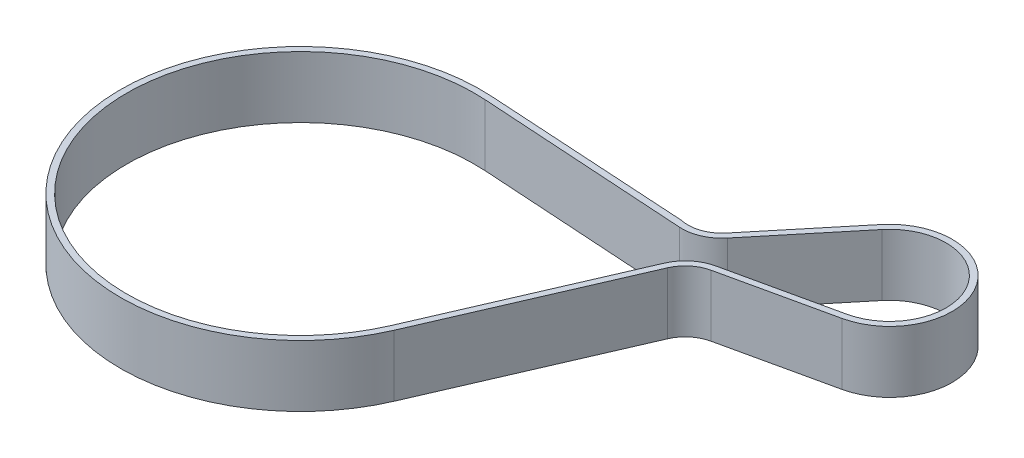
ISO-10303-21;
HEADER;
FILE_DESCRIPTION(('STEP AP214'),'2;1');
FILE_NAME('part.step','',(''),(''),'','','');
FILE_SCHEMA(('AUTOMOTIVE_DESIGN { 1 0 10303 214 1 1 1 1 }'));
ENDSEC;
DATA;
#1=APPLICATION_CONTEXT('core data for automotive mechanical design processes');
#2=APPLICATION_PROTOCOL_DEFINITION('international standard','automotive_design',2000,#1);
#3=PRODUCT_CONTEXT('',#1,'mechanical');
#4=PRODUCT('Part','Part','',(#3));
#5=PRODUCT_RELATED_PRODUCT_CATEGORY('part','',(#4));
#6=PRODUCT_DEFINITION_FORMATION('','',#4);
#7=PRODUCT_DEFINITION_CONTEXT('part definition',#1,'design');
#8=PRODUCT_DEFINITION('design','',#6,#7);
#9=PRODUCT_DEFINITION_SHAPE('','',#8);
#10=(LENGTH_UNIT() NAMED_UNIT(*) SI_UNIT(.MILLI.,.METRE.));
#11=(NAMED_UNIT(*) PLANE_ANGLE_UNIT() SI_UNIT($,.RADIAN.));
#12=(NAMED_UNIT(*) SI_UNIT($,.STERADIAN.) SOLID_ANGLE_UNIT());
#13=UNCERTAINTY_MEASURE_WITH_UNIT(LENGTH_MEASURE(1.E-05),#10,'distance_accuracy_value','');
#14=(GEOMETRIC_REPRESENTATION_CONTEXT(3) GLOBAL_UNCERTAINTY_ASSIGNED_CONTEXT((#13)) GLOBAL_UNIT_ASSIGNED_CONTEXT((#10,
#11,#12)) REPRESENTATION_CONTEXT('',''));
#15=CARTESIAN_POINT('',(0.,0.,0.));
#16=DIRECTION('',(0.,0.,1.));
#17=DIRECTION('',(1.,0.,0.));
#18=AXIS2_PLACEMENT_3D('',#15,#16,#17);
#19=CARTESIAN_POINT('',(37.0715224274978,7.,-24.207214546462));
#20=DIRECTION('',(0.,-1.,0.));
#21=DIRECTION('',(0.,0.,-1.));
#22=AXIS2_PLACEMENT_3D('',#19,#20,#21);
#23=CYLINDRICAL_SURFACE('',#22,9.17);
#24=CARTESIAN_POINT('',(37.0715224274978,0.,-24.207214546462));
#25=DIRECTION('',(0.,1.,0.));
#26=DIRECTION('',(0.,0.,1.));
#27=AXIS2_PLACEMENT_3D('',#24,#25,#26);
#28=CIRCLE('',#27,9.17);
#29=CARTESIAN_POINT('',(39.0527045898969,0.,-15.2537896576615));
#30=VERTEX_POINT('',#29);
#31=CARTESIAN_POINT('',(29.9994658756208,0.,-30.0445869114096));
#32=VERTEX_POINT('',#31);
#33=EDGE_CURVE('E271',#30,#32,#28,.T.);
#34=ORIENTED_EDGE('',*,*,#33,.F.);
#35=DIRECTION('',(0.,-1.,0.));
#36=VECTOR('',#35,1.);
#37=CARTESIAN_POINT('',(39.0527045898969,7.,-15.2537896576615));
#38=LINE('',#37,#36);
#39=CARTESIAN_POINT('',(39.0527045898969,10.,-15.2537896576615));
#40=VERTEX_POINT('',#39);
#41=EDGE_CURVE('E11',#40,#30,#38,.T.);
#42=ORIENTED_EDGE('',*,*,#41,.F.);
#43=CARTESIAN_POINT('',(37.0715224274978,10.,-24.207214546462));
#44=DIRECTION('',(0.,1.,0.));
#45=DIRECTION('',(0.,0.,1.));
#46=AXIS2_PLACEMENT_3D('',#43,#44,#45);
#47=CIRCLE('',#46,9.17000000000001);
#48=CARTESIAN_POINT('',(29.9994658756208,10.,-30.0445869114096));
#49=VERTEX_POINT('',#48);
#50=EDGE_CURVE('E184',#40,#49,#47,.T.);
#51=ORIENTED_EDGE('',*,*,#50,.T.);
#52=DIRECTION('',(0.,-1.,0.));
#53=VECTOR('',#52,1.);
#54=CARTESIAN_POINT('',(29.9994658756208,7.,-30.0445869114096));
#55=LINE('',#54,#53);
#56=EDGE_CURVE('E61',#49,#32,#55,.T.);
#57=ORIENTED_EDGE('',*,*,#56,.T.);
#58=EDGE_LOOP('',(#34,#42,#51,#57));
#59=FACE_BOUND('',#58,.T.);
#60=ADVANCED_FACE('F43',(#59),#23,.F.);
#61=CARTESIAN_POINT('',(-1.39485950516736,7.,-6.30369586753306));
#62=DIRECTION('',(-0.216050399389213,0.,-0.976382212519135));
#63=DIRECTION('',(-0.976382212519135,0.,0.216050399389213));
#64=AXIS2_PLACEMENT_3D('',#61,#62,#63);
#65=PLANE('',#64);
#66=DIRECTION('',(0.976382212519135,0.,-0.216050399389213));
#67=VECTOR('',#66,1.);
#68=CARTESIAN_POINT('',(-1.39485950516736,0.,-6.30369586753306));
#69=LINE('',#68,#67);
#70=CARTESIAN_POINT('',(21.601634897573,0.,-11.3922787365768));
#71=VERTEX_POINT('',#70);
#72=EDGE_CURVE('E166',#71,#30,#69,.T.);
#73=ORIENTED_EDGE('',*,*,#72,.F.);
#74=DIRECTION('',(0.,-1.,0.));
#75=VECTOR('',#74,1.);
#76=CARTESIAN_POINT('',(21.601634897573,7.,-11.3922787365768));
#77=LINE('',#76,#75);
#78=CARTESIAN_POINT('',(21.601634897573,10.,-11.3922787365768));
#79=VERTEX_POINT('',#78);
#80=EDGE_CURVE('E53',#79,#71,#77,.T.);
#81=ORIENTED_EDGE('',*,*,#80,.F.);
#82=DIRECTION('',(0.976382212519135,0.,-0.216050399389213));
#83=VECTOR('',#82,1.);
#84=CARTESIAN_POINT('',(21.601634897573,10.,-11.3922787365768));
#85=LINE('',#84,#83);
#86=EDGE_CURVE('E163',#79,#40,#85,.T.);
#87=ORIENTED_EDGE('',*,*,#86,.T.);
#88=ORIENTED_EDGE('',*,*,#41,.T.);
#89=EDGE_LOOP('',(#73,#81,#87,#88));
#90=FACE_BOUND('',#89,.T.);
#91=ADVANCED_FACE('F161',(#90),#65,.T.);
#92=CARTESIAN_POINT('',(23.0059624936029,7.,-5.04579435520239));
#93=DIRECTION('',(0.,-1.,0.));
#94=DIRECTION('',(0.,0.,-1.));
#95=AXIS2_PLACEMENT_3D('',#92,#93,#94);
#96=CYLINDRICAL_SURFACE('',#95,6.5);
#97=CARTESIAN_POINT('',(23.0059624936029,0.,-5.04579435520239));
#98=DIRECTION('',(0.,1.,0.));
#99=DIRECTION('',(0.,0.,1.));
#100=AXIS2_PLACEMENT_3D('',#97,#98,#99);
#101=CIRCLE('',#100,6.5);
#102=CARTESIAN_POINT('',(17.0413153761302,0.,-7.62900645722272));
#103=VERTEX_POINT('',#102);
#104=EDGE_CURVE('E276',#71,#103,#101,.T.);
#105=ORIENTED_EDGE('',*,*,#104,.T.);
#106=DIRECTION('',(0.,-1.,0.));
#107=VECTOR('',#106,1.);
#108=CARTESIAN_POINT('',(17.0413153761302,7.,-7.62900645722272));
#109=LINE('',#108,#107);
#110=CARTESIAN_POINT('',(17.0413153761302,10.,-7.62900645722272));
#111=VERTEX_POINT('',#110);
#112=EDGE_CURVE('E171',#111,#103,#109,.T.);
#113=ORIENTED_EDGE('',*,*,#112,.F.);
#114=CARTESIAN_POINT('',(23.0059624936029,10.,-5.04579435520239));
#115=DIRECTION('',(0.,-1.,0.));
#116=DIRECTION('',(0.,0.,1.));
#117=AXIS2_PLACEMENT_3D('',#114,#115,#116);
#118=CIRCLE('',#117,6.5);
#119=EDGE_CURVE('E174',#111,#79,#118,.T.);
#120=ORIENTED_EDGE('',*,*,#119,.T.);
#121=ORIENTED_EDGE('',*,*,#80,.T.);
#122=EDGE_LOOP('',(#105,#113,#120,#121));
#123=FACE_BOUND('',#122,.T.);
#124=ADVANCED_FACE('F175',(#123),#96,.T.);
#125=CARTESIAN_POINT('',(11.5676165036055,7.,5.00978622123501));
#126=DIRECTION('',(0.917638018072727,0.,0.397417246464667));
#127=DIRECTION('',(0.397417246464667,0.,-0.917638018072727));
#128=AXIS2_PLACEMENT_3D('',#125,#126,#127);
#129=PLANE('',#128);
#130=DIRECTION('',(-0.397417246464667,0.,0.917638018072727));
#131=VECTOR('',#130,1.);
#132=CARTESIAN_POINT('',(11.5676165036055,0.,5.00978622123501));
#133=LINE('',#132,#131);
#134=CARTESIAN_POINT('',(3.60785055487717,0.,23.3889177624306));
#135=VERTEX_POINT('',#134);
#136=EDGE_CURVE('E279',#103,#135,#133,.T.);
#137=ORIENTED_EDGE('',*,*,#136,.T.);
#138=DIRECTION('',(0.,-1.,0.));
#139=VECTOR('',#138,1.);
#140=CARTESIAN_POINT('',(3.60785055487717,7.,23.3889177624306));
#141=LINE('',#140,#139);
#142=CARTESIAN_POINT('',(3.60785055487717,10.,23.3889177624306));
#143=VERTEX_POINT('',#142);
#144=EDGE_CURVE('E309',#143,#135,#141,.T.);
#145=ORIENTED_EDGE('',*,*,#144,.F.);
#146=DIRECTION('',(0.397417246464667,0.,-0.917638018072727));
#147=VECTOR('',#146,1.);
#148=CARTESIAN_POINT('',(17.0413153761302,10.,-7.62900645722272));
#149=LINE('',#148,#147);
#150=EDGE_CURVE('E206',#143,#111,#149,.T.);
#151=ORIENTED_EDGE('',*,*,#150,.T.);
#152=ORIENTED_EDGE('',*,*,#112,.T.);
#153=EDGE_LOOP('',(#137,#145,#151,#152));
#154=FACE_BOUND('',#153,.T.);
#155=ADVANCED_FACE('F520',(#154),#129,.F.);
#156=CARTESIAN_POINT('',(-22.3337762160388,7.,12.1539322048745));
#157=DIRECTION('',(0.,-1.,0.));
#158=DIRECTION('',(0.,0.,-1.));
#159=AXIS2_PLACEMENT_3D('',#156,#157,#158);
#160=CYLINDRICAL_SURFACE('',#159,28.27);
#161=CARTESIAN_POINT('',(-22.3337762160388,0.,12.1539322048745));
#162=DIRECTION('',(0.,1.,0.));
#163=DIRECTION('',(0.,0.,1.));
#164=AXIS2_PLACEMENT_3D('',#161,#162,#163);
#165=CIRCLE('',#164,28.27);
#166=CARTESIAN_POINT('',(-20.5376343611678,0.,-16.0589509238875));
#167=VERTEX_POINT('',#166);
#168=EDGE_CURVE('E283',#167,#135,#165,.T.);
#169=ORIENTED_EDGE('',*,*,#168,.F.);
#170=DIRECTION('',(0.,-1.,0.));
#171=VECTOR('',#170,1.);
#172=CARTESIAN_POINT('',(-20.5376343611678,7.,-16.0589509238875));
#173=LINE('',#172,#171);
#174=CARTESIAN_POINT('',(-20.5376343611678,10.,-16.0589509238875));
#175=VERTEX_POINT('',#174);
#176=EDGE_CURVE('E306',#175,#167,#173,.T.);
#177=ORIENTED_EDGE('',*,*,#176,.F.);
#178=CARTESIAN_POINT('',(-22.3337762160388,10.,12.1539322048745));
#179=DIRECTION('',(0.,1.,0.));
#180=DIRECTION('',(0.,0.,1.));
#181=AXIS2_PLACEMENT_3D('',#178,#179,#180);
#182=CIRCLE('',#181,28.27);
#183=EDGE_CURVE('E202',#175,#143,#182,.T.);
#184=ORIENTED_EDGE('',*,*,#183,.T.);
#185=ORIENTED_EDGE('',*,*,#144,.T.);
#186=EDGE_LOOP('',(#169,#177,#184,#185));
#187=FACE_BOUND('',#186,.T.);
#188=ADVANCED_FACE('F508',(#187),#160,.F.);
#189=CARTESIAN_POINT('',(0.93534333914657,7.,-14.6918976588872));
#190=DIRECTION('',(-0.0635352619338865,0.,0.99797959422575));
#191=DIRECTION('',(0.99797959422575,0.,0.0635352619338865));
#192=AXIS2_PLACEMENT_3D('',#189,#190,#191);
#193=PLANE('',#192);
#194=DIRECTION('',(-0.99797959422575,0.,-0.0635352619338865));
#195=VECTOR('',#194,1.);
#196=CARTESIAN_POINT('',(0.93534333914657,0.,-14.6918976588872));
#197=LINE('',#196,#195);
#198=CARTESIAN_POINT('',(13.1959891557268,0.,-13.9113372667287));
#199=VERTEX_POINT('',#198);
#200=EDGE_CURVE('E287',#199,#167,#197,.T.);
#201=ORIENTED_EDGE('',*,*,#200,.F.);
#202=DIRECTION('',(0.,-1.,0.));
#203=VECTOR('',#202,1.);
#204=CARTESIAN_POINT('',(13.1959891557268,7.,-13.9113372667287));
#205=LINE('',#204,#203);
#206=CARTESIAN_POINT('',(13.1959891557268,10.,-13.9113372667287));
#207=VERTEX_POINT('',#206);
#208=EDGE_CURVE('E303',#207,#199,#205,.T.);
#209=ORIENTED_EDGE('',*,*,#208,.F.);
#210=DIRECTION('',(-0.99797959422575,0.,-0.0635352619338865));
#211=VECTOR('',#210,1.);
#212=CARTESIAN_POINT('',(13.1959891557268,10.,-13.9113372667287));
#213=LINE('',#212,#211);
#214=EDGE_CURVE('E198',#207,#175,#213,.T.);
#215=ORIENTED_EDGE('',*,*,#214,.T.);
#216=ORIENTED_EDGE('',*,*,#176,.T.);
#217=EDGE_LOOP('',(#201,#209,#215,#216));
#218=FACE_BOUND('',#217,.T.);
#219=ADVANCED_FACE('F496',(#218),#193,.T.);
#220=CARTESIAN_POINT('',(13.608968358297,7.,-20.3982046291961));
#221=DIRECTION('',(0.,-1.,0.));
#222=DIRECTION('',(0.,0.,-1.));
#223=AXIS2_PLACEMENT_3D('',#220,#221,#222);
#224=CYLINDRICAL_SURFACE('',#223,6.5);
#225=CARTESIAN_POINT('',(13.608968358297,0.,-20.3982046291961));
#226=DIRECTION('',(0.,1.,0.));
#227=DIRECTION('',(0.,0.,1.));
#228=AXIS2_PLACEMENT_3D('',#225,#226,#227);
#229=CIRCLE('',#228,6.5);
#230=CARTESIAN_POINT('',(18.6218764921248,0.,-16.260481578797));
#231=VERTEX_POINT('',#230);
#232=EDGE_CURVE('E291',#199,#231,#229,.T.);
#233=ORIENTED_EDGE('',*,*,#232,.T.);
#234=DIRECTION('',(0.,-1.,0.));
#235=VECTOR('',#234,1.);
#236=CARTESIAN_POINT('',(18.6218764921248,7.,-16.260481578797));
#237=LINE('',#236,#235);
#238=CARTESIAN_POINT('',(18.6218764921248,10.,-16.260481578797));
#239=VERTEX_POINT('',#238);
#240=EDGE_CURVE('E300',#239,#231,#237,.T.);
#241=ORIENTED_EDGE('',*,*,#240,.F.);
#242=CARTESIAN_POINT('',(13.608968358297,10.,-20.3982046291961));
#243=DIRECTION('',(0.,-1.,0.));
#244=DIRECTION('',(0.,0.,1.));
#245=AXIS2_PLACEMENT_3D('',#242,#243,#244);
#246=CIRCLE('',#245,6.5);
#247=EDGE_CURVE('E194',#239,#207,#246,.T.);
#248=ORIENTED_EDGE('',*,*,#247,.T.);
#249=ORIENTED_EDGE('',*,*,#208,.T.);
#250=EDGE_LOOP('',(#233,#241,#248,#249));
#251=FACE_BOUND('',#250,.T.);
#252=ADVANCED_FACE('F486',(#251),#224,.T.);
#253=CARTESIAN_POINT('',(-1.17880910577814,7.,-5.32731365501387));
#254=DIRECTION('',(0.216050399389214,0.,0.976382212519135));
#255=DIRECTION('',(0.976382212519135,0.,-0.216050399389214));
#256=AXIS2_PLACEMENT_3D('',#253,#254,#255);
#257=PLANE('',#256);
#258=DIRECTION('',(-0.976382212519135,0.,0.216050399389214));
#259=VECTOR('',#258,1.);
#260=CARTESIAN_POINT('',(-1.17880910577814,0.,-5.32731365501387));
#261=LINE('',#260,#259);
#262=CARTESIAN_POINT('',(39.2687549892861,0.,-14.2774074451424));
#263=VERTEX_POINT('',#262);
#264=CARTESIAN_POINT('',(21.8176852969622,0.,-10.4158965240576));
#265=VERTEX_POINT('',#264);
#266=EDGE_CURVE('E241',#263,#265,#261,.T.);
#267=ORIENTED_EDGE('',*,*,#266,.F.);
#268=DIRECTION('',(0.,-1.,0.));
#269=VECTOR('',#268,1.);
#270=CARTESIAN_POINT('',(39.2687549892861,7.,-14.2774074451424));
#271=LINE('',#270,#269);
#272=CARTESIAN_POINT('',(39.2687549892861,10.,-14.2774074451424));
#273=VERTEX_POINT('',#272);
#274=EDGE_CURVE('E47',#273,#263,#271,.T.);
#275=ORIENTED_EDGE('',*,*,#274,.F.);
#276=DIRECTION('',(0.976382212519135,0.,-0.216050399389214));
#277=VECTOR('',#276,1.);
#278=CARTESIAN_POINT('',(21.8176852969622,10.,-10.4158965240576));
#279=LINE('',#278,#277);
#280=CARTESIAN_POINT('',(21.8176852969622,10.,-10.4158965240576));
#281=VERTEX_POINT('',#280);
#282=EDGE_CURVE('E213',#281,#273,#279,.T.);
#283=ORIENTED_EDGE('',*,*,#282,.F.);
#284=DIRECTION('',(0.,-1.,0.));
#285=VECTOR('',#284,1.);
#286=CARTESIAN_POINT('',(21.8176852969622,7.,-10.4158965240576));
#287=LINE('',#286,#285);
#288=EDGE_CURVE('E297',#281,#265,#287,.T.);
#289=ORIENTED_EDGE('',*,*,#288,.T.);
#290=EDGE_LOOP('',(#267,#275,#283,#289));
#291=FACE_BOUND('',#290,.T.);
#292=ADVANCED_FACE('F45',(#291),#257,.T.);
#293=CARTESIAN_POINT('',(37.0715224274978,7.,-24.207214546462));
#294=DIRECTION('',(0.,-1.,0.));
#295=DIRECTION('',(0.,0.,-1.));
#296=AXIS2_PLACEMENT_3D('',#293,#294,#295);
#297=CYLINDRICAL_SURFACE('',#296,10.17);
#298=CARTESIAN_POINT('',(37.0715224274978,0.,-24.207214546462));
#299=DIRECTION('',(0.,1.,0.));
#300=DIRECTION('',(0.,0.,1.));
#301=AXIS2_PLACEMENT_3D('',#298,#299,#300);
#302=CIRCLE('',#301,10.17);
#303=CARTESIAN_POINT('',(29.2282492396473,0.,-30.6811596883941));
#304=VERTEX_POINT('',#303);
#305=EDGE_CURVE('E245',#263,#304,#302,.T.);
#306=ORIENTED_EDGE('',*,*,#305,.T.);
#307=DIRECTION('',(0.,-1.,0.));
#308=VECTOR('',#307,1.);
#309=CARTESIAN_POINT('',(29.2282492396473,7.,-30.6811596883941));
#310=LINE('',#309,#308);
#311=CARTESIAN_POINT('',(29.2282492396473,10.,-30.6811596883941));
#312=VERTEX_POINT('',#311);
#313=EDGE_CURVE('E331',#312,#304,#310,.T.);
#314=ORIENTED_EDGE('',*,*,#313,.F.);
#315=CARTESIAN_POINT('',(37.0715224274978,10.,-24.207214546462));
#316=DIRECTION('',(0.,1.,0.));
#317=DIRECTION('',(0.,0.,1.));
#318=AXIS2_PLACEMENT_3D('',#315,#316,#317);
#319=CIRCLE('',#318,10.17);
#320=EDGE_CURVE('E217',#273,#312,#319,.T.);
#321=ORIENTED_EDGE('',*,*,#320,.F.);
#322=ORIENTED_EDGE('',*,*,#274,.T.);
#323=EDGE_LOOP('',(#306,#314,#321,#322));
#324=FACE_BOUND('',#323,.T.);
#325=ADVANCED_FACE('F341',(#324),#297,.T.);
#326=CARTESIAN_POINT('',(2.32176390132331,7.,1.91641573226963));
#327=DIRECTION('',(0.7712166359735,0.,0.636572776984468));
#328=DIRECTION('',(0.636572776984468,0.,-0.7712166359735));
#329=AXIS2_PLACEMENT_3D('',#326,#327,#328);
#330=PLANE('',#329);
#331=DIRECTION('',(-0.636572776984468,0.,0.7712166359735));
#332=VECTOR('',#331,1.);
#333=CARTESIAN_POINT('',(2.32176390132331,0.,1.91641573226963));
#334=LINE('',#333,#332);
#335=CARTESIAN_POINT('',(17.8506598561513,0.,-16.8970543557815));
#336=VERTEX_POINT('',#335);
#337=EDGE_CURVE('E248',#304,#336,#334,.T.);
#338=ORIENTED_EDGE('',*,*,#337,.T.);
#339=DIRECTION('',(0.,-1.,0.));
#340=VECTOR('',#339,1.);
#341=CARTESIAN_POINT('',(17.8506598561513,7.,-16.8970543557815));
#342=LINE('',#341,#340);
#343=CARTESIAN_POINT('',(17.8506598561513,10.,-16.8970543557815));
#344=VERTEX_POINT('',#343);
#345=EDGE_CURVE('E329',#344,#336,#342,.T.);
#346=ORIENTED_EDGE('',*,*,#345,.F.);
#347=DIRECTION('',(-0.636572776984468,0.,0.7712166359735));
#348=VECTOR('',#347,1.);
#349=CARTESIAN_POINT('',(29.2282492396473,10.,-30.6811596883941));
#350=LINE('',#349,#348);
#351=EDGE_CURVE('E221',#312,#344,#350,.T.);
#352=ORIENTED_EDGE('',*,*,#351,.F.);
#353=ORIENTED_EDGE('',*,*,#313,.T.);
#354=EDGE_LOOP('',(#338,#346,#352,#353));
#355=FACE_BOUND('',#354,.T.);
#356=ADVANCED_FACE('F368',(#355),#330,.F.);
#357=CARTESIAN_POINT('',(13.608968358297,7.,-20.3982046291961));
#358=DIRECTION('',(0.,-1.,0.));
#359=DIRECTION('',(0.,0.,-1.));
#360=AXIS2_PLACEMENT_3D('',#357,#358,#359);
#361=CYLINDRICAL_SURFACE('',#360,5.5);
#362=CARTESIAN_POINT('',(13.608968358297,0.,-20.3982046291961));
#363=DIRECTION('',(0.,1.,0.));
#364=DIRECTION('',(0.,0.,1.));
#365=AXIS2_PLACEMENT_3D('',#362,#363,#364);
#366=CIRCLE('',#365,5.5);
#367=CARTESIAN_POINT('',(12.3809176973598,0.,-15.0370581497412));
#368=VERTEX_POINT('',#367);
#369=EDGE_CURVE('E252',#368,#336,#366,.T.);
#370=ORIENTED_EDGE('',*,*,#369,.F.);
#371=DIRECTION('',(0.,-1.,0.));
#372=VECTOR('',#371,1.);
#373=CARTESIAN_POINT('',(12.3809176973598,7.,-15.0370581497412));
#374=LINE('',#373,#372);
#375=CARTESIAN_POINT('',(12.3809176973598,10.,-15.0370581497412));
#376=VERTEX_POINT('',#375);
#377=EDGE_CURVE('E326',#376,#368,#374,.T.);
#378=ORIENTED_EDGE('',*,*,#377,.F.);
#379=CARTESIAN_POINT('',(13.608968358297,10.,-20.3982046291961));
#380=DIRECTION('',(0.,-1.,0.));
#381=DIRECTION('',(0.,0.,1.));
#382=AXIS2_PLACEMENT_3D('',#379,#380,#381);
#383=CIRCLE('',#382,5.5);
#384=EDGE_CURVE('E225',#344,#376,#383,.T.);
#385=ORIENTED_EDGE('',*,*,#384,.F.);
#386=ORIENTED_EDGE('',*,*,#345,.T.);
#387=EDGE_LOOP('',(#370,#378,#385,#386));
#388=FACE_BOUND('',#387,.T.);
#389=ADVANCED_FACE('F367',(#388),#361,.F.);
#390=CARTESIAN_POINT('',(0.967625838658651,7.,-15.7387526458147));
#391=DIRECTION('',(0.0613646004397327,0.,-0.998115417080045));
#392=DIRECTION('',(-0.998115417080045,0.,-0.0613646004397327));
#393=AXIS2_PLACEMENT_3D('',#390,#391,#392);
#394=PLANE('',#393);
#395=DIRECTION('',(0.998115417080045,0.,0.0613646004397327));
#396=VECTOR('',#395,1.);
#397=CARTESIAN_POINT('',(0.967625838658651,0.,-15.7387526458147));
#398=LINE('',#397,#396);
#399=CARTESIAN_POINT('',(-20.5376343611678,0.,-17.0609060530584));
#400=VERTEX_POINT('',#399);
#401=EDGE_CURVE('E256',#400,#368,#398,.T.);
#402=ORIENTED_EDGE('',*,*,#401,.F.);
#403=DIRECTION('',(0.,-1.,0.));
#404=VECTOR('',#403,1.);
#405=CARTESIAN_POINT('',(-20.5376343611678,7.,-17.0609060530584));
#406=LINE('',#405,#404);
#407=CARTESIAN_POINT('',(-20.5376343611678,10.,-17.0609060530584));
#408=VERTEX_POINT('',#407);
#409=EDGE_CURVE('E323',#408,#400,#406,.T.);
#410=ORIENTED_EDGE('',*,*,#409,.F.);
#411=DIRECTION('',(-0.998115417080045,0.,-0.0613646004397327));
#412=VECTOR('',#411,1.);
#413=CARTESIAN_POINT('',(12.3809176973598,10.,-15.0370581497412));
#414=LINE('',#413,#412);
#415=EDGE_CURVE('E229',#376,#408,#414,.T.);
#416=ORIENTED_EDGE('',*,*,#415,.F.);
#417=ORIENTED_EDGE('',*,*,#377,.T.);
#418=EDGE_LOOP('',(#402,#410,#416,#417));
#419=FACE_BOUND('',#418,.T.);
#420=ADVANCED_FACE('F364',(#419),#394,.T.);
#421=CARTESIAN_POINT('',(-22.3337762160388,7.,12.1539322048745));
#422=DIRECTION('',(0.,-1.,0.));
#423=DIRECTION('',(0.,0.,-1.));
#424=AXIS2_PLACEMENT_3D('',#421,#422,#423);
#425=CYLINDRICAL_SURFACE('',#424,29.27);
#426=CARTESIAN_POINT('',(-22.3337762160388,0.,12.1539322048745));
#427=DIRECTION('',(0.,1.,0.));
#428=DIRECTION('',(0.,0.,1.));
#429=AXIS2_PLACEMENT_3D('',#426,#427,#428);
#430=CIRCLE('',#429,29.27);
#431=CARTESIAN_POINT('',(4.52548857294989,0.,23.7863350088953));
#432=VERTEX_POINT('',#431);
#433=EDGE_CURVE('E260',#400,#432,#430,.T.);
#434=ORIENTED_EDGE('',*,*,#433,.T.);
#435=DIRECTION('',(0.,-1.,0.));
#436=VECTOR('',#435,1.);
#437=CARTESIAN_POINT('',(4.52548857294989,7.,23.7863350088953));
#438=LINE('',#437,#436);
#439=CARTESIAN_POINT('',(4.52548857294989,10.,23.7863350088953));
#440=VERTEX_POINT('',#439);
#441=EDGE_CURVE('E319',#440,#432,#438,.T.);
#442=ORIENTED_EDGE('',*,*,#441,.F.);
#443=CARTESIAN_POINT('',(-22.3337762160388,10.,12.1539322048745));
#444=DIRECTION('',(0.,1.,0.));
#445=DIRECTION('',(0.,0.,1.));
#446=AXIS2_PLACEMENT_3D('',#443,#444,#445);
#447=CIRCLE('',#446,29.27);
#448=EDGE_CURVE('E233',#408,#440,#447,.T.);
#449=ORIENTED_EDGE('',*,*,#448,.F.);
#450=ORIENTED_EDGE('',*,*,#409,.T.);
#451=EDGE_LOOP('',(#434,#442,#449,#450));
#452=FACE_BOUND('',#451,.T.);
#453=ADVANCED_FACE('F359',(#452),#425,.T.);
#454=CARTESIAN_POINT('',(12.4852545216783,7.,5.40720346769968));
#455=DIRECTION('',(-0.917638018072727,0.,-0.397417246464668));
#456=DIRECTION('',(-0.397417246464668,0.,0.917638018072727));
#457=AXIS2_PLACEMENT_3D('',#454,#455,#456);
#458=PLANE('',#457);
#459=DIRECTION('',(0.397417246464668,0.,-0.917638018072727));
#460=VECTOR('',#459,1.);
#461=CARTESIAN_POINT('',(12.4852545216783,0.,5.40720346769968));
#462=LINE('',#461,#460);
#463=CARTESIAN_POINT('',(17.9589533942029,0.,-7.23158921075805));
#464=VERTEX_POINT('',#463);
#465=EDGE_CURVE('E263',#432,#464,#462,.T.);
#466=ORIENTED_EDGE('',*,*,#465,.T.);
#467=DIRECTION('',(0.,-1.,0.));
#468=VECTOR('',#467,1.);
#469=CARTESIAN_POINT('',(17.9589533942029,7.,-7.23158921075805));
#470=LINE('',#469,#468);
#471=CARTESIAN_POINT('',(17.9589533942029,10.,-7.23158921075805));
#472=VERTEX_POINT('',#471);
#473=EDGE_CURVE('E316',#472,#464,#470,.T.);
#474=ORIENTED_EDGE('',*,*,#473,.F.);
#475=DIRECTION('',(0.397417246464667,0.,-0.917638018072727));
#476=VECTOR('',#475,1.);
#477=CARTESIAN_POINT('',(4.52548857294989,10.,23.7863350088953));
#478=LINE('',#477,#476);
#479=EDGE_CURVE('E237',#440,#472,#478,.T.);
#480=ORIENTED_EDGE('',*,*,#479,.F.);
#481=ORIENTED_EDGE('',*,*,#441,.T.);
#482=EDGE_LOOP('',(#466,#474,#480,#481));
#483=FACE_BOUND('',#482,.T.);
#484=ADVANCED_FACE('F355',(#483),#458,.F.);
#485=CARTESIAN_POINT('',(23.0059624936029,7.,-5.04579435520239));
#486=DIRECTION('',(0.,-1.,0.));
#487=DIRECTION('',(0.,0.,-1.));
#488=AXIS2_PLACEMENT_3D('',#485,#486,#487);
#489=CYLINDRICAL_SURFACE('',#488,5.5);
#490=CARTESIAN_POINT('',(23.0059624936029,0.,-5.04579435520239));
#491=DIRECTION('',(0.,1.,0.));
#492=DIRECTION('',(0.,0.,1.));
#493=AXIS2_PLACEMENT_3D('',#490,#491,#492);
#494=CIRCLE('',#493,5.5);
#495=EDGE_CURVE('E267',#265,#464,#494,.T.);
#496=ORIENTED_EDGE('',*,*,#495,.F.);
#497=ORIENTED_EDGE('',*,*,#288,.F.);
#498=CARTESIAN_POINT('',(23.0059624936029,10.,-5.04579435520239));
#499=DIRECTION('',(0.,-1.,0.));
#500=DIRECTION('',(0.,0.,1.));
#501=AXIS2_PLACEMENT_3D('',#498,#499,#500);
#502=CIRCLE('',#501,5.49999999999998);
#503=EDGE_CURVE('E209',#472,#281,#502,.T.);
#504=ORIENTED_EDGE('',*,*,#503,.F.);
#505=ORIENTED_EDGE('',*,*,#473,.T.);
#506=EDGE_LOOP('',(#496,#497,#504,#505));
#507=FACE_BOUND('',#506,.T.);
#508=ADVANCED_FACE('F350',(#507),#489,.F.);
#509=CARTESIAN_POINT('',(3.09298053729681,7.,2.55298850925409));
#510=DIRECTION('',(-0.7712166359735,0.,-0.636572776984468));
#511=DIRECTION('',(-0.636572776984468,0.,0.7712166359735));
#512=AXIS2_PLACEMENT_3D('',#509,#510,#511);
#513=PLANE('',#512);
#514=DIRECTION('',(0.636572776984468,0.,-0.771216635973501));
#515=VECTOR('',#514,1.);
#516=CARTESIAN_POINT('',(3.09298053729681,0.,2.55298850925409));
#517=LINE('',#516,#515);
#518=EDGE_CURVE('E68',#231,#32,#517,.T.);
#519=ORIENTED_EDGE('',*,*,#518,.T.);
#520=ORIENTED_EDGE('',*,*,#56,.F.);
#521=DIRECTION('',(-0.636572776984468,0.,0.7712166359735));
#522=VECTOR('',#521,1.);
#523=CARTESIAN_POINT('',(18.6218764921248,10.,-16.260481578797));
#524=LINE('',#523,#522);
#525=EDGE_CURVE('E188',#49,#239,#524,.T.);
#526=ORIENTED_EDGE('',*,*,#525,.T.);
#527=ORIENTED_EDGE('',*,*,#240,.T.);
#528=EDGE_LOOP('',(#519,#520,#526,#527));
#529=FACE_BOUND('',#528,.T.);
#530=ADVANCED_FACE('F386',(#529),#513,.F.);
#531=CARTESIAN_POINT('',(0.,0.,0.));
#532=DIRECTION('',(0.,1.,0.));
#533=DIRECTION('',(0.,0.,1.));
#534=AXIS2_PLACEMENT_3D('',#531,#532,#533);
#535=PLANE('',#534);
#536=ORIENTED_EDGE('',*,*,#266,.T.);
#537=ORIENTED_EDGE('',*,*,#495,.T.);
#538=ORIENTED_EDGE('',*,*,#465,.F.);
#539=ORIENTED_EDGE('',*,*,#433,.F.);
#540=ORIENTED_EDGE('',*,*,#401,.T.);
#541=ORIENTED_EDGE('',*,*,#369,.T.);
#542=ORIENTED_EDGE('',*,*,#337,.F.);
#543=ORIENTED_EDGE('',*,*,#305,.F.);
#544=EDGE_LOOP('',(#536,#537,#538,#539,#540,#541,#542,#543));
#545=FACE_BOUND('',#544,.T.);
#546=ORIENTED_EDGE('',*,*,#33,.T.);
#547=ORIENTED_EDGE('',*,*,#518,.F.);
#548=ORIENTED_EDGE('',*,*,#232,.F.);
#549=ORIENTED_EDGE('',*,*,#200,.T.);
#550=ORIENTED_EDGE('',*,*,#168,.T.);
#551=ORIENTED_EDGE('',*,*,#136,.F.);
#552=ORIENTED_EDGE('',*,*,#104,.F.);
#553=ORIENTED_EDGE('',*,*,#72,.T.);
#554=EDGE_LOOP('',(#546,#547,#548,#549,#550,#551,#552,#553));
#555=FACE_BOUND('',#554,.T.);
#556=ADVANCED_FACE('F346',(#545,#555),#535,.F.);
#557=CARTESIAN_POINT('',(23.0059624936029,10.,-5.04579435520239));
#558=DIRECTION('',(0.,1.,0.));
#559=DIRECTION('',(0.,0.,1.));
#560=AXIS2_PLACEMENT_3D('',#557,#558,#559);
#561=PLANE('',#560);
#562=ORIENTED_EDGE('',*,*,#503,.T.);
#563=ORIENTED_EDGE('',*,*,#282,.T.);
#564=ORIENTED_EDGE('',*,*,#320,.T.);
#565=ORIENTED_EDGE('',*,*,#351,.T.);
#566=ORIENTED_EDGE('',*,*,#384,.T.);
#567=ORIENTED_EDGE('',*,*,#415,.T.);
#568=ORIENTED_EDGE('',*,*,#448,.T.);
#569=ORIENTED_EDGE('',*,*,#479,.T.);
#570=EDGE_LOOP('',(#562,#563,#564,#565,#566,#567,#568,#569));
#571=FACE_BOUND('',#570,.T.);
#572=ORIENTED_EDGE('',*,*,#86,.F.);
#573=ORIENTED_EDGE('',*,*,#119,.F.);
#574=ORIENTED_EDGE('',*,*,#150,.F.);
#575=ORIENTED_EDGE('',*,*,#183,.F.);
#576=ORIENTED_EDGE('',*,*,#214,.F.);
#577=ORIENTED_EDGE('',*,*,#247,.F.);
#578=ORIENTED_EDGE('',*,*,#525,.F.);
#579=ORIENTED_EDGE('',*,*,#50,.F.);
#580=EDGE_LOOP('',(#572,#573,#574,#575,#576,#577,#578,#579));
#581=FACE_BOUND('',#580,.T.);
#582=ADVANCED_FACE('F182',(#571,#581),#561,.T.);
#583=CLOSED_SHELL('',(#60,#91,#124,#155,#188,#219,#252,#292,#325,#356,#389,#420,#453,#484,#508,
#530,#556,#582));
#584=MANIFOLD_SOLID_BREP('B2',#583);
#585=ADVANCED_BREP_SHAPE_REPRESENTATION('',(#18,#584),#14);
#586=SHAPE_DEFINITION_REPRESENTATION(#9,#585);
ENDSEC;
END-ISO-10303-21;
